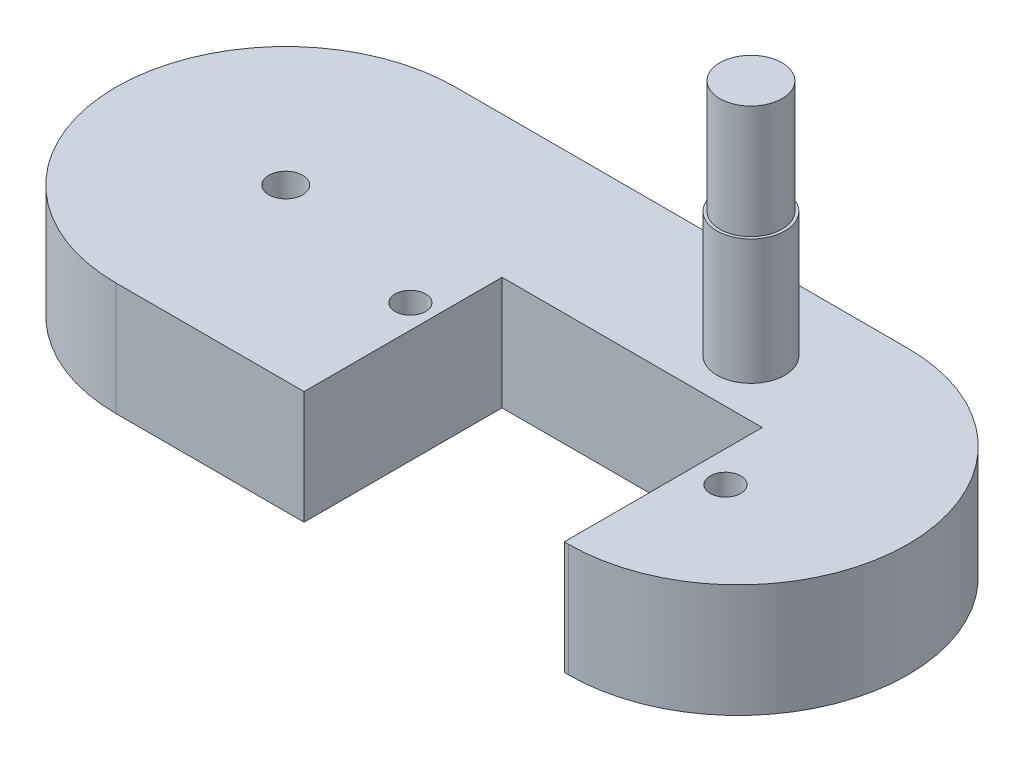
ISO-10303-21;
HEADER;
FILE_DESCRIPTION(('STEP AP214'),'2;1');
FILE_NAME('part.step','',(''),(''),'','','');
FILE_SCHEMA(('AUTOMOTIVE_DESIGN { 1 0 10303 214 1 1 1 1 }'));
ENDSEC;
DATA;
#1=APPLICATION_CONTEXT('core data for automotive mechanical design processes');
#2=APPLICATION_PROTOCOL_DEFINITION('international standard','automotive_design',2000,#1);
#3=PRODUCT_CONTEXT('',#1,'mechanical');
#4=PRODUCT('Part','Part','',(#3));
#5=PRODUCT_RELATED_PRODUCT_CATEGORY('part','',(#4));
#6=PRODUCT_DEFINITION_FORMATION('','',#4);
#7=PRODUCT_DEFINITION_CONTEXT('part definition',#1,'design');
#8=PRODUCT_DEFINITION('design','',#6,#7);
#9=PRODUCT_DEFINITION_SHAPE('','',#8);
#10=(LENGTH_UNIT() NAMED_UNIT(*) SI_UNIT(.MILLI.,.METRE.));
#11=(NAMED_UNIT(*) PLANE_ANGLE_UNIT() SI_UNIT($,.RADIAN.));
#12=(NAMED_UNIT(*) SI_UNIT($,.STERADIAN.) SOLID_ANGLE_UNIT());
#13=UNCERTAINTY_MEASURE_WITH_UNIT(LENGTH_MEASURE(1.E-05),#10,'distance_accuracy_value','');
#14=(GEOMETRIC_REPRESENTATION_CONTEXT(3) GLOBAL_UNCERTAINTY_ASSIGNED_CONTEXT((#13)) GLOBAL_UNIT_ASSIGNED_CONTEXT((#10,
#11,#12)) REPRESENTATION_CONTEXT('',''));
#15=CARTESIAN_POINT('',(0.,0.,0.));
#16=DIRECTION('',(0.,0.,1.));
#17=DIRECTION('',(1.,0.,0.));
#18=AXIS2_PLACEMENT_3D('',#15,#16,#17);
#19=CARTESIAN_POINT('',(33.6202697471812,21.05,-7.5));
#20=DIRECTION('',(0.,1.,0.));
#21=DIRECTION('',(0.,0.,1.));
#22=AXIS2_PLACEMENT_3D('',#19,#20,#21);
#23=CYLINDRICAL_SURFACE('',#22,2.75);
#24=CARTESIAN_POINT('',(33.6202697471812,21.05,-7.5));
#25=DIRECTION('',(0.,1.,0.));
#26=DIRECTION('',(0.,0.,1.));
#27=AXIS2_PLACEMENT_3D('',#24,#25,#26);
#28=CIRCLE('',#27,2.75);
#29=CARTESIAN_POINT('',(33.6202697471812,21.05,-4.75));
#30=VERTEX_POINT('',#29);
#31=EDGE_CURVE('E241',#30,#30,#28,.T.);
#32=ORIENTED_EDGE('',*,*,#31,.T.);
#33=EDGE_LOOP('',(#32));
#34=FACE_BOUND('',#33,.T.);
#35=CARTESIAN_POINT('',(33.6202697471812,31.05,-7.5));
#36=DIRECTION('',(0.,1.,0.));
#37=DIRECTION('',(0.,0.,1.));
#38=AXIS2_PLACEMENT_3D('',#35,#36,#37);
#39=CIRCLE('',#38,2.75);
#40=CARTESIAN_POINT('',(33.6202697471812,31.05,-4.75));
#41=VERTEX_POINT('',#40);
#42=EDGE_CURVE('E245',#41,#41,#39,.T.);
#43=ORIENTED_EDGE('',*,*,#42,.F.);
#44=EDGE_LOOP('',(#43));
#45=FACE_BOUND('',#44,.T.);
#46=ADVANCED_FACE('F39',(#34,#45),#23,.T.);
#47=CARTESIAN_POINT('',(33.6202697471812,34.05,-7.5));
#48=DIRECTION('',(0.,-1.,0.));
#49=DIRECTION('',(0.,0.,-1.));
#50=AXIS2_PLACEMENT_3D('',#47,#48,#49);
#51=CYLINDRICAL_SURFACE('',#50,3.);
#52=CARTESIAN_POINT('',(33.6202697471812,10.,-7.5));
#53=DIRECTION('',(0.,1.,0.));
#54=DIRECTION('',(0.,0.,1.));
#55=AXIS2_PLACEMENT_3D('',#52,#53,#54);
#56=CIRCLE('',#55,3.);
#57=CARTESIAN_POINT('',(33.6202697471812,10.,-4.5));
#58=VERTEX_POINT('',#57);
#59=EDGE_CURVE('E234',#58,#58,#56,.T.);
#60=ORIENTED_EDGE('',*,*,#59,.T.);
#61=EDGE_LOOP('',(#60));
#62=FACE_BOUND('',#61,.T.);
#63=CARTESIAN_POINT('',(33.6202697471812,21.05,-7.5));
#64=DIRECTION('',(0.,1.,0.));
#65=DIRECTION('',(0.,0.,1.));
#66=AXIS2_PLACEMENT_3D('',#63,#64,#65);
#67=CIRCLE('',#66,3.);
#68=CARTESIAN_POINT('',(33.6202697471812,21.05,-4.5));
#69=VERTEX_POINT('',#68);
#70=EDGE_CURVE('E43',#69,#69,#67,.T.);
#71=ORIENTED_EDGE('',*,*,#70,.F.);
#72=EDGE_LOOP('',(#71));
#73=FACE_BOUND('',#72,.T.);
#74=ADVANCED_FACE('F253',(#62,#73),#51,.T.);
#75=CARTESIAN_POINT('',(0.,10.,0.));
#76=DIRECTION('',(0.,1.,0.));
#77=DIRECTION('',(0.,0.,1.));
#78=AXIS2_PLACEMENT_3D('',#75,#76,#77);
#79=PLANE('',#78);
#80=ORIENTED_EDGE('',*,*,#59,.F.);
#81=EDGE_LOOP('',(#80));
#82=FACE_BOUND('',#81,.T.);
#83=CARTESIAN_POINT('',(42.3702697471812,10.,3.5));
#84=DIRECTION('',(0.,1.,0.));
#85=DIRECTION('',(0.,0.,1.));
#86=AXIS2_PLACEMENT_3D('',#83,#84,#85);
#87=CIRCLE('',#86,1.35);
#88=CARTESIAN_POINT('',(42.3702697471812,10.,4.85));
#89=VERTEX_POINT('',#88);
#90=EDGE_CURVE('E218',#89,#89,#87,.T.);
#91=ORIENTED_EDGE('',*,*,#90,.F.);
#92=EDGE_LOOP('',(#91));
#93=FACE_BOUND('',#92,.T.);
#94=CARTESIAN_POINT('',(0.,10.,0.));
#95=DIRECTION('',(0.,1.,0.));
#96=DIRECTION('',(0.,0.,1.));
#97=AXIS2_PLACEMENT_3D('',#94,#95,#96);
#98=CIRCLE('',#97,15.);
#99=CARTESIAN_POINT('',(0.,10.,-15.));
#100=VERTEX_POINT('',#99);
#101=CARTESIAN_POINT('',(0.,10.,15.));
#102=VERTEX_POINT('',#101);
#103=EDGE_CURVE('E168',#100,#102,#98,.T.);
#104=ORIENTED_EDGE('',*,*,#103,.T.);
#105=DIRECTION('',(1.,0.,0.));
#106=VECTOR('',#105,1.);
#107=CARTESIAN_POINT('',(0.,10.,15.));
#108=LINE('',#107,#106);
#109=CARTESIAN_POINT('',(16.6202697471812,10.,15.));
#110=VERTEX_POINT('',#109);
#111=EDGE_CURVE('E101',#102,#110,#108,.T.);
#112=ORIENTED_EDGE('',*,*,#111,.T.);
#113=DIRECTION('',(0.,0.,-1.));
#114=VECTOR('',#113,1.);
#115=CARTESIAN_POINT('',(16.6202697471812,10.,10.));
#116=LINE('',#115,#114);
#117=CARTESIAN_POINT('',(16.6202697471812,10.,-2.5));
#118=VERTEX_POINT('',#117);
#119=EDGE_CURVE('E189',#110,#118,#116,.T.);
#120=ORIENTED_EDGE('',*,*,#119,.T.);
#121=DIRECTION('',(1.,0.,0.));
#122=VECTOR('',#121,1.);
#123=CARTESIAN_POINT('',(16.6202697471812,10.,-2.5));
#124=LINE('',#123,#122);
#125=CARTESIAN_POINT('',(39.6202697471812,10.,-2.5));
#126=VERTEX_POINT('',#125);
#127=EDGE_CURVE('E204',#118,#126,#124,.T.);
#128=ORIENTED_EDGE('',*,*,#127,.T.);
#129=DIRECTION('',(0.,0.,1.));
#130=VECTOR('',#129,1.);
#131=CARTESIAN_POINT('',(39.6202697471812,10.,-2.5));
#132=LINE('',#131,#130);
#133=CARTESIAN_POINT('',(39.6202697471812,10.,15.));
#134=VERTEX_POINT('',#133);
#135=EDGE_CURVE('E121',#126,#134,#132,.T.);
#136=ORIENTED_EDGE('',*,*,#135,.T.);
#137=DIRECTION('',(1.,0.,0.));
#138=VECTOR('',#137,1.);
#139=CARTESIAN_POINT('',(39.6202697471812,10.,15.));
#140=LINE('',#139,#138);
#141=CARTESIAN_POINT('',(40.,10.,15.));
#142=VERTEX_POINT('',#141);
#143=EDGE_CURVE('E114',#134,#142,#140,.T.);
#144=ORIENTED_EDGE('',*,*,#143,.T.);
#145=CARTESIAN_POINT('',(40.,10.,0.));
#146=DIRECTION('',(0.,1.,0.));
#147=DIRECTION('',(0.,0.,1.));
#148=AXIS2_PLACEMENT_3D('',#145,#146,#147);
#149=CIRCLE('',#148,15.);
#150=CARTESIAN_POINT('',(40.,10.,-15.));
#151=VERTEX_POINT('',#150);
#152=EDGE_CURVE('E119',#142,#151,#149,.T.);
#153=ORIENTED_EDGE('',*,*,#152,.T.);
#154=DIRECTION('',(-1.,0.,0.));
#155=VECTOR('',#154,1.);
#156=CARTESIAN_POINT('',(0.,10.,-15.));
#157=LINE('',#156,#155);
#158=EDGE_CURVE('E58',#151,#100,#157,.T.);
#159=ORIENTED_EDGE('',*,*,#158,.T.);
#160=EDGE_LOOP('',(#104,#112,#120,#128,#136,#144,#153,#159));
#161=FACE_BOUND('',#160,.T.);
#162=CARTESIAN_POINT('',(0.,10.,0.));
#163=DIRECTION('',(0.,1.,0.));
#164=DIRECTION('',(0.,0.,1.));
#165=AXIS2_PLACEMENT_3D('',#162,#163,#164);
#166=CIRCLE('',#165,1.5);
#167=CARTESIAN_POINT('',(0.,10.,1.5));
#168=VERTEX_POINT('',#167);
#169=EDGE_CURVE('E148',#168,#168,#166,.T.);
#170=ORIENTED_EDGE('',*,*,#169,.F.);
#171=EDGE_LOOP('',(#170));
#172=FACE_BOUND('',#171,.T.);
#173=CARTESIAN_POINT('',(14.5202697471812,10.,3.5));
#174=DIRECTION('',(0.,1.,0.));
#175=DIRECTION('',(0.,0.,1.));
#176=AXIS2_PLACEMENT_3D('',#173,#174,#175);
#177=CIRCLE('',#176,1.35);
#178=CARTESIAN_POINT('',(14.5202697471812,10.,4.85));
#179=VERTEX_POINT('',#178);
#180=EDGE_CURVE('E226',#179,#179,#177,.T.);
#181=ORIENTED_EDGE('',*,*,#180,.F.);
#182=EDGE_LOOP('',(#181));
#183=FACE_BOUND('',#182,.T.);
#184=ADVANCED_FACE('F116',(#82,#93,#161,#172,#183),#79,.T.);
#185=CARTESIAN_POINT('',(0.,0.,0.));
#186=DIRECTION('',(0.,1.,0.));
#187=DIRECTION('',(0.,0.,1.));
#188=AXIS2_PLACEMENT_3D('',#185,#186,#187);
#189=PLANE('',#188);
#190=CARTESIAN_POINT('',(0.,0.,0.));
#191=DIRECTION('',(0.,1.,0.));
#192=DIRECTION('',(0.,0.,1.));
#193=AXIS2_PLACEMENT_3D('',#190,#191,#192);
#194=CIRCLE('',#193,15.);
#195=CARTESIAN_POINT('',(0.,0.,-15.));
#196=VERTEX_POINT('',#195);
#197=CARTESIAN_POINT('',(0.,0.,15.));
#198=VERTEX_POINT('',#197);
#199=EDGE_CURVE('E143',#196,#198,#194,.T.);
#200=ORIENTED_EDGE('',*,*,#199,.F.);
#201=DIRECTION('',(-1.,0.,0.));
#202=VECTOR('',#201,1.);
#203=CARTESIAN_POINT('',(0.,0.,-15.));
#204=LINE('',#203,#202);
#205=CARTESIAN_POINT('',(40.,0.,-15.));
#206=VERTEX_POINT('',#205);
#207=EDGE_CURVE('E93',#206,#196,#204,.T.);
#208=ORIENTED_EDGE('',*,*,#207,.F.);
#209=CARTESIAN_POINT('',(40.,0.,0.));
#210=DIRECTION('',(0.,1.,0.));
#211=DIRECTION('',(0.,0.,1.));
#212=AXIS2_PLACEMENT_3D('',#209,#210,#211);
#213=CIRCLE('',#212,15.);
#214=CARTESIAN_POINT('',(40.,0.,15.));
#215=VERTEX_POINT('',#214);
#216=EDGE_CURVE('E87',#215,#206,#213,.T.);
#217=ORIENTED_EDGE('',*,*,#216,.F.);
#218=DIRECTION('',(1.,0.,0.));
#219=VECTOR('',#218,1.);
#220=CARTESIAN_POINT('',(39.6202697471812,0.,15.));
#221=LINE('',#220,#219);
#222=CARTESIAN_POINT('',(39.6202697471812,0.,15.));
#223=VERTEX_POINT('',#222);
#224=EDGE_CURVE('E130',#223,#215,#221,.T.);
#225=ORIENTED_EDGE('',*,*,#224,.F.);
#226=DIRECTION('',(0.,0.,1.));
#227=VECTOR('',#226,1.);
#228=CARTESIAN_POINT('',(39.6202697471812,0.,10.));
#229=LINE('',#228,#227);
#230=CARTESIAN_POINT('',(39.6202697471812,0.,-2.5));
#231=VERTEX_POINT('',#230);
#232=EDGE_CURVE('E159',#231,#223,#229,.T.);
#233=ORIENTED_EDGE('',*,*,#232,.F.);
#234=DIRECTION('',(1.,0.,0.));
#235=VECTOR('',#234,1.);
#236=CARTESIAN_POINT('',(16.6202697471812,0.,-2.5));
#237=LINE('',#236,#235);
#238=CARTESIAN_POINT('',(16.6202697471812,0.,-2.5));
#239=VERTEX_POINT('',#238);
#240=EDGE_CURVE('E155',#239,#231,#237,.T.);
#241=ORIENTED_EDGE('',*,*,#240,.F.);
#242=DIRECTION('',(0.,0.,-1.));
#243=VECTOR('',#242,1.);
#244=CARTESIAN_POINT('',(16.6202697471812,0.,-2.5));
#245=LINE('',#244,#243);
#246=CARTESIAN_POINT('',(16.6202697471812,0.,15.));
#247=VERTEX_POINT('',#246);
#248=EDGE_CURVE('E152',#247,#239,#245,.T.);
#249=ORIENTED_EDGE('',*,*,#248,.F.);
#250=DIRECTION('',(1.,0.,0.));
#251=VECTOR('',#250,1.);
#252=CARTESIAN_POINT('',(0.,0.,15.));
#253=LINE('',#252,#251);
#254=EDGE_CURVE('E147',#198,#247,#253,.T.);
#255=ORIENTED_EDGE('',*,*,#254,.F.);
#256=EDGE_LOOP('',(#200,#208,#217,#225,#233,#241,#249,#255));
#257=FACE_BOUND('',#256,.T.);
#258=CARTESIAN_POINT('',(0.,0.,0.));
#259=DIRECTION('',(0.,1.,0.));
#260=DIRECTION('',(0.,0.,1.));
#261=AXIS2_PLACEMENT_3D('',#258,#259,#260);
#262=CIRCLE('',#261,1.5);
#263=CARTESIAN_POINT('',(0.,0.,1.5));
#264=VERTEX_POINT('',#263);
#265=EDGE_CURVE('E214',#264,#264,#262,.T.);
#266=ORIENTED_EDGE('',*,*,#265,.T.);
#267=EDGE_LOOP('',(#266));
#268=FACE_BOUND('',#267,.T.);
#269=CARTESIAN_POINT('',(42.3702697471812,0.,3.5));
#270=DIRECTION('',(0.,1.,0.));
#271=DIRECTION('',(0.,0.,1.));
#272=AXIS2_PLACEMENT_3D('',#269,#270,#271);
#273=CIRCLE('',#272,1.35);
#274=CARTESIAN_POINT('',(42.3702697471812,0.,4.85));
#275=VERTEX_POINT('',#274);
#276=EDGE_CURVE('E222',#275,#275,#273,.T.);
#277=ORIENTED_EDGE('',*,*,#276,.T.);
#278=EDGE_LOOP('',(#277));
#279=FACE_BOUND('',#278,.T.);
#280=CARTESIAN_POINT('',(14.5202697471812,0.,3.5));
#281=DIRECTION('',(0.,1.,0.));
#282=DIRECTION('',(0.,0.,1.));
#283=AXIS2_PLACEMENT_3D('',#280,#281,#282);
#284=CIRCLE('',#283,1.35);
#285=CARTESIAN_POINT('',(14.5202697471812,0.,4.85));
#286=VERTEX_POINT('',#285);
#287=EDGE_CURVE('E230',#286,#286,#284,.T.);
#288=ORIENTED_EDGE('',*,*,#287,.T.);
#289=EDGE_LOOP('',(#288));
#290=FACE_BOUND('',#289,.T.);
#291=ADVANCED_FACE('F194',(#257,#268,#279,#290),#189,.F.);
#292=CARTESIAN_POINT('',(0.,10.,0.));
#293=DIRECTION('',(0.,-1.,0.));
#294=DIRECTION('',(0.,0.,-1.));
#295=AXIS2_PLACEMENT_3D('',#292,#293,#294);
#296=CYLINDRICAL_SURFACE('',#295,15.);
#297=ORIENTED_EDGE('',*,*,#199,.T.);
#298=DIRECTION('',(0.,-1.,0.));
#299=VECTOR('',#298,1.);
#300=CARTESIAN_POINT('',(0.,10.,15.));
#301=LINE('',#300,#299);
#302=EDGE_CURVE('E12',#102,#198,#301,.T.);
#303=ORIENTED_EDGE('',*,*,#302,.F.);
#304=ORIENTED_EDGE('',*,*,#103,.F.);
#305=DIRECTION('',(0.,-1.,0.));
#306=VECTOR('',#305,1.);
#307=CARTESIAN_POINT('',(0.,10.,-15.));
#308=LINE('',#307,#306);
#309=EDGE_CURVE('E139',#100,#196,#308,.T.);
#310=ORIENTED_EDGE('',*,*,#309,.T.);
#311=EDGE_LOOP('',(#297,#303,#304,#310));
#312=FACE_BOUND('',#311,.T.);
#313=ADVANCED_FACE('F41',(#312),#296,.T.);
#314=CARTESIAN_POINT('',(0.,10.,15.));
#315=DIRECTION('',(0.,0.,-1.));
#316=DIRECTION('',(-1.,0.,0.));
#317=AXIS2_PLACEMENT_3D('',#314,#315,#316);
#318=PLANE('',#317);
#319=ORIENTED_EDGE('',*,*,#254,.T.);
#320=DIRECTION('',(0.,-1.,0.));
#321=VECTOR('',#320,1.);
#322=CARTESIAN_POINT('',(16.6202697471812,10.,15.));
#323=LINE('',#322,#321);
#324=EDGE_CURVE('E50',#110,#247,#323,.T.);
#325=ORIENTED_EDGE('',*,*,#324,.F.);
#326=ORIENTED_EDGE('',*,*,#111,.F.);
#327=ORIENTED_EDGE('',*,*,#302,.T.);
#328=EDGE_LOOP('',(#319,#325,#326,#327));
#329=FACE_BOUND('',#328,.T.);
#330=ADVANCED_FACE('F190',(#329),#318,.F.);
#331=CARTESIAN_POINT('',(16.6202697471812,10.,-2.5));
#332=DIRECTION('',(-1.,0.,0.));
#333=DIRECTION('',(0.,0.,1.));
#334=AXIS2_PLACEMENT_3D('',#331,#332,#333);
#335=PLANE('',#334);
#336=ORIENTED_EDGE('',*,*,#248,.T.);
#337=DIRECTION('',(0.,-1.,0.));
#338=VECTOR('',#337,1.);
#339=CARTESIAN_POINT('',(16.6202697471812,10.,-2.5));
#340=LINE('',#339,#338);
#341=EDGE_CURVE('E179',#118,#239,#340,.T.);
#342=ORIENTED_EDGE('',*,*,#341,.F.);
#343=ORIENTED_EDGE('',*,*,#119,.F.);
#344=ORIENTED_EDGE('',*,*,#324,.T.);
#345=EDGE_LOOP('',(#336,#342,#343,#344));
#346=FACE_BOUND('',#345,.T.);
#347=ADVANCED_FACE('F187',(#346),#335,.F.);
#348=CARTESIAN_POINT('',(16.6202697471812,10.,-2.5));
#349=DIRECTION('',(0.,0.,-1.));
#350=DIRECTION('',(-1.,0.,0.));
#351=AXIS2_PLACEMENT_3D('',#348,#349,#350);
#352=PLANE('',#351);
#353=ORIENTED_EDGE('',*,*,#240,.T.);
#354=DIRECTION('',(0.,-1.,0.));
#355=VECTOR('',#354,1.);
#356=CARTESIAN_POINT('',(39.6202697471812,10.,-2.5));
#357=LINE('',#356,#355);
#358=EDGE_CURVE('E175',#126,#231,#357,.T.);
#359=ORIENTED_EDGE('',*,*,#358,.F.);
#360=ORIENTED_EDGE('',*,*,#127,.F.);
#361=ORIENTED_EDGE('',*,*,#341,.T.);
#362=EDGE_LOOP('',(#353,#359,#360,#361));
#363=FACE_BOUND('',#362,.T.);
#364=ADVANCED_FACE('F199',(#363),#352,.F.);
#365=CARTESIAN_POINT('',(39.6202697471812,10.,10.));
#366=DIRECTION('',(1.,0.,0.));
#367=DIRECTION('',(0.,0.,-1.));
#368=AXIS2_PLACEMENT_3D('',#365,#366,#367);
#369=PLANE('',#368);
#370=ORIENTED_EDGE('',*,*,#232,.T.);
#371=DIRECTION('',(0.,-1.,0.));
#372=VECTOR('',#371,1.);
#373=CARTESIAN_POINT('',(39.6202697471812,10.,15.));
#374=LINE('',#373,#372);
#375=EDGE_CURVE('E132',#134,#223,#374,.T.);
#376=ORIENTED_EDGE('',*,*,#375,.F.);
#377=ORIENTED_EDGE('',*,*,#135,.F.);
#378=ORIENTED_EDGE('',*,*,#358,.T.);
#379=EDGE_LOOP('',(#370,#376,#377,#378));
#380=FACE_BOUND('',#379,.T.);
#381=ADVANCED_FACE('F202',(#380),#369,.F.);
#382=CARTESIAN_POINT('',(39.6202697471812,10.,15.));
#383=DIRECTION('',(0.,0.,-1.));
#384=DIRECTION('',(-1.,0.,0.));
#385=AXIS2_PLACEMENT_3D('',#382,#383,#384);
#386=PLANE('',#385);
#387=ORIENTED_EDGE('',*,*,#224,.T.);
#388=DIRECTION('',(0.,-1.,0.));
#389=VECTOR('',#388,1.);
#390=CARTESIAN_POINT('',(40.,10.,15.));
#391=LINE('',#390,#389);
#392=EDGE_CURVE('E127',#142,#215,#391,.T.);
#393=ORIENTED_EDGE('',*,*,#392,.F.);
#394=ORIENTED_EDGE('',*,*,#143,.F.);
#395=ORIENTED_EDGE('',*,*,#375,.T.);
#396=EDGE_LOOP('',(#387,#393,#394,#395));
#397=FACE_BOUND('',#396,.T.);
#398=ADVANCED_FACE('F128',(#397),#386,.F.);
#399=CARTESIAN_POINT('',(40.,10.,0.));
#400=DIRECTION('',(0.,-1.,0.));
#401=DIRECTION('',(0.,0.,-1.));
#402=AXIS2_PLACEMENT_3D('',#399,#400,#401);
#403=CYLINDRICAL_SURFACE('',#402,15.);
#404=ORIENTED_EDGE('',*,*,#216,.T.);
#405=DIRECTION('',(0.,-1.,0.));
#406=VECTOR('',#405,1.);
#407=CARTESIAN_POINT('',(40.,10.,-15.));
#408=LINE('',#407,#406);
#409=EDGE_CURVE('E133',#151,#206,#408,.T.);
#410=ORIENTED_EDGE('',*,*,#409,.F.);
#411=ORIENTED_EDGE('',*,*,#152,.F.);
#412=ORIENTED_EDGE('',*,*,#392,.T.);
#413=EDGE_LOOP('',(#404,#410,#411,#412));
#414=FACE_BOUND('',#413,.T.);
#415=ADVANCED_FACE('F135',(#414),#403,.T.);
#416=CARTESIAN_POINT('',(0.,10.,-15.));
#417=DIRECTION('',(0.,0.,1.));
#418=DIRECTION('',(1.,0.,0.));
#419=AXIS2_PLACEMENT_3D('',#416,#417,#418);
#420=PLANE('',#419);
#421=ORIENTED_EDGE('',*,*,#207,.T.);
#422=ORIENTED_EDGE('',*,*,#309,.F.);
#423=ORIENTED_EDGE('',*,*,#158,.F.);
#424=ORIENTED_EDGE('',*,*,#409,.T.);
#425=EDGE_LOOP('',(#421,#422,#423,#424));
#426=FACE_BOUND('',#425,.T.);
#427=ADVANCED_FACE('F280',(#426),#420,.F.);
#428=CARTESIAN_POINT('',(0.,10.,0.));
#429=DIRECTION('',(0.,-1.,0.));
#430=DIRECTION('',(0.,0.,-1.));
#431=AXIS2_PLACEMENT_3D('',#428,#429,#430);
#432=CYLINDRICAL_SURFACE('',#431,1.5);
#433=ORIENTED_EDGE('',*,*,#169,.T.);
#434=EDGE_LOOP('',(#433));
#435=FACE_BOUND('',#434,.T.);
#436=ORIENTED_EDGE('',*,*,#265,.F.);
#437=EDGE_LOOP('',(#436));
#438=FACE_BOUND('',#437,.T.);
#439=ADVANCED_FACE('F276',(#435,#438),#432,.F.);
#440=CARTESIAN_POINT('',(42.3702697471812,10.,3.5));
#441=DIRECTION('',(0.,-1.,0.));
#442=DIRECTION('',(0.,0.,-1.));
#443=AXIS2_PLACEMENT_3D('',#440,#441,#442);
#444=CYLINDRICAL_SURFACE('',#443,1.35);
#445=ORIENTED_EDGE('',*,*,#90,.T.);
#446=EDGE_LOOP('',(#445));
#447=FACE_BOUND('',#446,.T.);
#448=ORIENTED_EDGE('',*,*,#276,.F.);
#449=EDGE_LOOP('',(#448));
#450=FACE_BOUND('',#449,.T.);
#451=ADVANCED_FACE('F272',(#447,#450),#444,.F.);
#452=CARTESIAN_POINT('',(14.5202697471812,10.,3.5));
#453=DIRECTION('',(0.,-1.,0.));
#454=DIRECTION('',(0.,0.,-1.));
#455=AXIS2_PLACEMENT_3D('',#452,#453,#454);
#456=CYLINDRICAL_SURFACE('',#455,1.35);
#457=ORIENTED_EDGE('',*,*,#180,.T.);
#458=EDGE_LOOP('',(#457));
#459=FACE_BOUND('',#458,.T.);
#460=ORIENTED_EDGE('',*,*,#287,.F.);
#461=EDGE_LOOP('',(#460));
#462=FACE_BOUND('',#461,.T.);
#463=ADVANCED_FACE('F267',(#459,#462),#456,.F.);
#464=CARTESIAN_POINT('',(20.,21.05,0.));
#465=DIRECTION('',(0.,1.,0.));
#466=DIRECTION('',(0.,0.,1.));
#467=AXIS2_PLACEMENT_3D('',#464,#465,#466);
#468=PLANE('',#467);
#469=ORIENTED_EDGE('',*,*,#31,.F.);
#470=EDGE_LOOP('',(#469));
#471=FACE_BOUND('',#470,.T.);
#472=ORIENTED_EDGE('',*,*,#70,.T.);
#473=EDGE_LOOP('',(#472));
#474=FACE_BOUND('',#473,.T.);
#475=ADVANCED_FACE('F265',(#471,#474),#468,.T.);
#476=CARTESIAN_POINT('',(33.6202697471812,31.05,-7.5));
#477=DIRECTION('',(0.,1.,0.));
#478=DIRECTION('',(0.,0.,1.));
#479=AXIS2_PLACEMENT_3D('',#476,#477,#478);
#480=PLANE('',#479);
#481=ORIENTED_EDGE('',*,*,#42,.T.);
#482=EDGE_LOOP('',(#481));
#483=FACE_BOUND('',#482,.T.);
#484=ADVANCED_FACE('F250',(#483),#480,.T.);
#485=CLOSED_SHELL('',(#46,#74,#184,#291,#313,#330,#347,#364,#381,#398,#415,#427,#439,#451,#463,
#475,#484));
#486=MANIFOLD_SOLID_BREP('B2',#485);
#487=ADVANCED_BREP_SHAPE_REPRESENTATION('',(#18,#486),#14);
#488=SHAPE_DEFINITION_REPRESENTATION(#9,#487);
ENDSEC;
END-ISO-10303-21;
